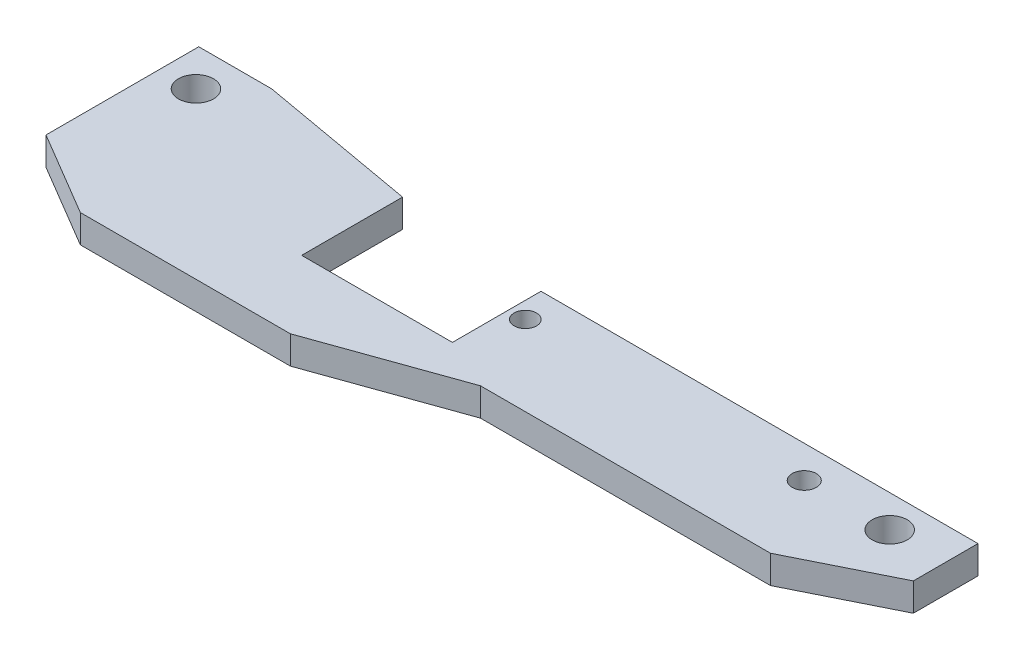
ISO-10303-21;
HEADER;
FILE_DESCRIPTION(('STEP AP214'),'2;1');
FILE_NAME('part.step','',(''),(''),'','','');
FILE_SCHEMA(('AUTOMOTIVE_DESIGN { 1 0 10303 214 1 1 1 1 }'));
ENDSEC;
DATA;
#1=APPLICATION_CONTEXT('core data for automotive mechanical design processes');
#2=APPLICATION_PROTOCOL_DEFINITION('international standard','automotive_design',2000,#1);
#3=PRODUCT_CONTEXT('',#1,'mechanical');
#4=PRODUCT('Part','Part','',(#3));
#5=PRODUCT_RELATED_PRODUCT_CATEGORY('part','',(#4));
#6=PRODUCT_DEFINITION_FORMATION('','',#4);
#7=PRODUCT_DEFINITION_CONTEXT('part definition',#1,'design');
#8=PRODUCT_DEFINITION('design','',#6,#7);
#9=PRODUCT_DEFINITION_SHAPE('','',#8);
#10=(LENGTH_UNIT() NAMED_UNIT(*) SI_UNIT(.MILLI.,.METRE.));
#11=(NAMED_UNIT(*) PLANE_ANGLE_UNIT() SI_UNIT($,.RADIAN.));
#12=(NAMED_UNIT(*) SI_UNIT($,.STERADIAN.) SOLID_ANGLE_UNIT());
#13=UNCERTAINTY_MEASURE_WITH_UNIT(LENGTH_MEASURE(1.E-05),#10,'distance_accuracy_value','');
#14=(GEOMETRIC_REPRESENTATION_CONTEXT(3) GLOBAL_UNCERTAINTY_ASSIGNED_CONTEXT((#13)) GLOBAL_UNIT_ASSIGNED_CONTEXT((#10,
#11,#12)) REPRESENTATION_CONTEXT('',''));
#15=CARTESIAN_POINT('',(0.,0.,0.));
#16=DIRECTION('',(0.,0.,1.));
#17=DIRECTION('',(1.,0.,0.));
#18=AXIS2_PLACEMENT_3D('',#15,#16,#17);
#19=CARTESIAN_POINT('',(0.,2.54,0.));
#20=DIRECTION('',(0.,-1.,0.));
#21=DIRECTION('',(0.,0.,-1.));
#22=AXIS2_PLACEMENT_3D('',#19,#20,#21);
#23=PLANE('',#22);
#24=DIRECTION('',(-1.,0.,0.));
#25=VECTOR('',#24,1.);
#26=CARTESIAN_POINT('',(24.145875,2.54,0.253999999999983));
#27=LINE('',#26,#25);
#28=CARTESIAN_POINT('',(71.12,2.54,0.253999999999983));
#29=VERTEX_POINT('',#28);
#30=CARTESIAN_POINT('',(31.52,2.54,0.253999999999983));
#31=VERTEX_POINT('',#30);
#32=EDGE_CURVE('E168',#29,#31,#27,.T.);
#33=ORIENTED_EDGE('',*,*,#32,.T.);
#34=DIRECTION('',(0.,0.,1.));
#35=VECTOR('',#34,1.);
#36=CARTESIAN_POINT('',(31.52,2.54,8.28024587558157));
#37=LINE('',#36,#35);
#38=CARTESIAN_POINT('',(31.52,2.54,8.28024587558157));
#39=VERTEX_POINT('',#38);
#40=EDGE_CURVE('E265',#31,#39,#37,.T.);
#41=ORIENTED_EDGE('',*,*,#40,.T.);
#42=DIRECTION('',(-1.,0.,0.));
#43=VECTOR('',#42,1.);
#44=CARTESIAN_POINT('',(31.52,2.54,8.28024587558157));
#45=LINE('',#44,#43);
#46=CARTESIAN_POINT('',(17.8578973191788,2.54,8.28024587558157));
#47=VERTEX_POINT('',#46);
#48=EDGE_CURVE('E273',#39,#47,#45,.T.);
#49=ORIENTED_EDGE('',*,*,#48,.T.);
#50=DIRECTION('',(0.,0.,-1.));
#51=VECTOR('',#50,1.);
#52=CARTESIAN_POINT('',(17.8578973191788,2.54,8.28024587558157));
#53=LINE('',#52,#51);
#54=CARTESIAN_POINT('',(17.8578973191788,2.54,-0.863862698812682));
#55=VERTEX_POINT('',#54);
#56=EDGE_CURVE('E262',#47,#55,#53,.T.);
#57=ORIENTED_EDGE('',*,*,#56,.T.);
#58=DIRECTION('',(-0.984562507785907,0.,-0.175033334717494));
#59=VECTOR('',#58,1.);
#60=CARTESIAN_POINT('',(3.42900000000006,2.54,-3.429));
#61=LINE('',#60,#59);
#62=CARTESIAN_POINT('',(3.42900000000006,2.54,-3.429));
#63=VERTEX_POINT('',#62);
#64=EDGE_CURVE('E101',#55,#63,#61,.T.);
#65=ORIENTED_EDGE('',*,*,#64,.T.);
#66=DIRECTION('',(-1.,0.,0.));
#67=VECTOR('',#66,1.);
#68=CARTESIAN_POINT('',(-3.17499999999998,2.54,-3.429));
#69=LINE('',#68,#67);
#70=CARTESIAN_POINT('',(-3.17499999999998,2.54,-3.429));
#71=VERTEX_POINT('',#70);
#72=EDGE_CURVE('E210',#63,#71,#69,.T.);
#73=ORIENTED_EDGE('',*,*,#72,.T.);
#74=DIRECTION('',(0.,0.,1.));
#75=VECTOR('',#74,1.);
#76=CARTESIAN_POINT('',(-3.17499999999998,2.54,-3.429));
#77=LINE('',#76,#75);
#78=CARTESIAN_POINT('',(-3.17499999999998,2.54,10.414));
#79=VERTEX_POINT('',#78);
#80=EDGE_CURVE('E207',#71,#79,#77,.T.);
#81=ORIENTED_EDGE('',*,*,#80,.T.);
#82=DIRECTION('',(0.860113535076458,0.,0.510102643375114));
#83=VECTOR('',#82,1.);
#84=CARTESIAN_POINT('',(4.46721168152167,2.54,14.946323025971));
#85=LINE('',#84,#83);
#86=CARTESIAN_POINT('',(4.46721168152167,2.54,14.946323025971));
#87=VERTEX_POINT('',#86);
#88=EDGE_CURVE('E209',#79,#87,#85,.T.);
#89=ORIENTED_EDGE('',*,*,#88,.T.);
#90=DIRECTION('',(1.,0.,0.));
#91=VECTOR('',#90,1.);
#92=CARTESIAN_POINT('',(23.4975463155963,2.54,14.946323025971));
#93=LINE('',#92,#91);
#94=CARTESIAN_POINT('',(23.4975463155963,2.54,14.946323025971));
#95=VERTEX_POINT('',#94);
#96=EDGE_CURVE('E212',#87,#95,#93,.T.);
#97=ORIENTED_EDGE('',*,*,#96,.T.);
#98=DIRECTION('',(0.941800205077323,0.,-0.336173130568629));
#99=VECTOR('',#98,1.);
#100=CARTESIAN_POINT('',(36.1950000000002,2.54,10.414));
#101=LINE('',#100,#99);
#102=CARTESIAN_POINT('',(36.1950000000002,2.54,10.414));
#103=VERTEX_POINT('',#102);
#104=EDGE_CURVE('E127',#95,#103,#101,.T.);
#105=ORIENTED_EDGE('',*,*,#104,.T.);
#106=DIRECTION('',(1.,0.,0.));
#107=VECTOR('',#106,1.);
#108=CARTESIAN_POINT('',(62.4739530384143,2.54,10.414));
#109=LINE('',#108,#107);
#110=CARTESIAN_POINT('',(62.4739530384143,2.54,10.414));
#111=VERTEX_POINT('',#110);
#112=EDGE_CURVE('E120',#103,#111,#109,.T.);
#113=ORIENTED_EDGE('',*,*,#112,.T.);
#114=DIRECTION('',(0.89533171087953,0.,-0.445399963508679));
#115=VECTOR('',#114,1.);
#116=CARTESIAN_POINT('',(71.12,2.54,6.11285780388403));
#117=LINE('',#116,#115);
#118=CARTESIAN_POINT('',(71.12,2.54,6.11285780388403));
#119=VERTEX_POINT('',#118);
#120=EDGE_CURVE('E124',#111,#119,#117,.T.);
#121=ORIENTED_EDGE('',*,*,#120,.T.);
#122=DIRECTION('',(0.,0.,-1.));
#123=VECTOR('',#122,1.);
#124=CARTESIAN_POINT('',(71.12,2.54,0.253999999999983));
#125=LINE('',#124,#123);
#126=EDGE_CURVE('E57',#119,#29,#125,.T.);
#127=ORIENTED_EDGE('',*,*,#126,.T.);
#128=EDGE_LOOP('',(#33,#41,#49,#57,#65,#73,#81,#89,#97,#105,#113,#121,#127));
#129=FACE_BOUND('',#128,.T.);
#130=CARTESIAN_POINT('',(66.04,2.54,3.175));
#131=DIRECTION('',(0.,1.,0.));
#132=DIRECTION('',(0.,0.,1.));
#133=AXIS2_PLACEMENT_3D('',#130,#131,#132);
#134=CIRCLE('',#133,1.5875);
#135=CARTESIAN_POINT('',(66.04,2.54,4.7625));
#136=VERTEX_POINT('',#135);
#137=EDGE_CURVE('E244',#136,#136,#134,.T.);
#138=ORIENTED_EDGE('',*,*,#137,.F.);
#139=EDGE_LOOP('',(#138));
#140=FACE_BOUND('',#139,.T.);
#141=CARTESIAN_POINT('',(0.,2.54,0.));
#142=DIRECTION('',(0.,1.,0.));
#143=DIRECTION('',(0.,0.,1.));
#144=AXIS2_PLACEMENT_3D('',#141,#142,#143);
#145=CIRCLE('',#144,1.5875);
#146=CARTESIAN_POINT('',(0.,2.54,1.5875));
#147=VERTEX_POINT('',#146);
#148=EDGE_CURVE('E152',#147,#147,#145,.T.);
#149=ORIENTED_EDGE('',*,*,#148,.F.);
#150=EDGE_LOOP('',(#149));
#151=FACE_BOUND('',#150,.T.);
#152=CARTESIAN_POINT('',(33.02,2.54,3.175));
#153=DIRECTION('',(0.,1.,0.));
#154=DIRECTION('',(0.,0.,1.));
#155=AXIS2_PLACEMENT_3D('',#152,#153,#154);
#156=CIRCLE('',#155,1.016);
#157=CARTESIAN_POINT('',(33.02,2.54,4.191));
#158=VERTEX_POINT('',#157);
#159=EDGE_CURVE('E238',#158,#158,#156,.T.);
#160=ORIENTED_EDGE('',*,*,#159,.F.);
#161=EDGE_LOOP('',(#160));
#162=FACE_BOUND('',#161,.T.);
#163=CARTESIAN_POINT('',(58.296606113269,2.54,3.175));
#164=DIRECTION('',(0.,1.,0.));
#165=DIRECTION('',(0.,0.,1.));
#166=AXIS2_PLACEMENT_3D('',#163,#164,#165);
#167=CIRCLE('',#166,1.0922);
#168=CARTESIAN_POINT('',(58.296606113269,2.54,4.2672));
#169=VERTEX_POINT('',#168);
#170=EDGE_CURVE('E250',#169,#169,#167,.T.);
#171=ORIENTED_EDGE('',*,*,#170,.F.);
#172=EDGE_LOOP('',(#171));
#173=FACE_BOUND('',#172,.T.);
#174=ADVANCED_FACE('F33',(#129,#140,#151,#162,#173),#23,.F.);
#175=CARTESIAN_POINT('',(0.,0.,0.));
#176=DIRECTION('',(0.,-1.,0.));
#177=DIRECTION('',(0.,0.,-1.));
#178=AXIS2_PLACEMENT_3D('',#175,#176,#177);
#179=PLANE('',#178);
#180=DIRECTION('',(0.,0.,1.));
#181=VECTOR('',#180,1.);
#182=CARTESIAN_POINT('',(31.52,0.,8.28024587558157));
#183=LINE('',#182,#181);
#184=CARTESIAN_POINT('',(31.52,0.,0.253999999999983));
#185=VERTEX_POINT('',#184);
#186=CARTESIAN_POINT('',(31.52,0.,8.28024587558157));
#187=VERTEX_POINT('',#186);
#188=EDGE_CURVE('E269',#185,#187,#183,.T.);
#189=ORIENTED_EDGE('',*,*,#188,.F.);
#190=DIRECTION('',(-1.,0.,0.));
#191=VECTOR('',#190,1.);
#192=CARTESIAN_POINT('',(24.145875,0.,0.253999999999983));
#193=LINE('',#192,#191);
#194=CARTESIAN_POINT('',(71.12,0.,0.253999999999983));
#195=VERTEX_POINT('',#194);
#196=EDGE_CURVE('E148',#195,#185,#193,.T.);
#197=ORIENTED_EDGE('',*,*,#196,.F.);
#198=DIRECTION('',(0.,0.,-1.));
#199=VECTOR('',#198,1.);
#200=CARTESIAN_POINT('',(71.12,0.,0.253999999999983));
#201=LINE('',#200,#199);
#202=CARTESIAN_POINT('',(71.12,0.,6.11285780388403));
#203=VERTEX_POINT('',#202);
#204=EDGE_CURVE('E93',#203,#195,#201,.T.);
#205=ORIENTED_EDGE('',*,*,#204,.F.);
#206=DIRECTION('',(0.89533171087953,0.,-0.445399963508679));
#207=VECTOR('',#206,1.);
#208=CARTESIAN_POINT('',(71.12,0.,6.11285780388403));
#209=LINE('',#208,#207);
#210=CARTESIAN_POINT('',(62.4739530384143,0.,10.414));
#211=VERTEX_POINT('',#210);
#212=EDGE_CURVE('E165',#211,#203,#209,.T.);
#213=ORIENTED_EDGE('',*,*,#212,.F.);
#214=DIRECTION('',(1.,0.,0.));
#215=VECTOR('',#214,1.);
#216=CARTESIAN_POINT('',(62.4739530384143,0.,10.414));
#217=LINE('',#216,#215);
#218=CARTESIAN_POINT('',(36.1950000000002,0.,10.414));
#219=VERTEX_POINT('',#218);
#220=EDGE_CURVE('E136',#219,#211,#217,.T.);
#221=ORIENTED_EDGE('',*,*,#220,.F.);
#222=DIRECTION('',(0.941800205077323,0.,-0.336173130568629));
#223=VECTOR('',#222,1.);
#224=CARTESIAN_POINT('',(36.1950000000002,0.,10.414));
#225=LINE('',#224,#223);
#226=CARTESIAN_POINT('',(23.4975463155963,0.,14.946323025971));
#227=VERTEX_POINT('',#226);
#228=EDGE_CURVE('E162',#227,#219,#225,.T.);
#229=ORIENTED_EDGE('',*,*,#228,.F.);
#230=DIRECTION('',(1.,0.,0.));
#231=VECTOR('',#230,1.);
#232=CARTESIAN_POINT('',(23.4975463155963,0.,14.946323025971));
#233=LINE('',#232,#231);
#234=CARTESIAN_POINT('',(4.46721168152167,0.,14.946323025971));
#235=VERTEX_POINT('',#234);
#236=EDGE_CURVE('E160',#235,#227,#233,.T.);
#237=ORIENTED_EDGE('',*,*,#236,.F.);
#238=DIRECTION('',(0.860113535076458,0.,0.510102643375114));
#239=VECTOR('',#238,1.);
#240=CARTESIAN_POINT('',(4.46721168152167,0.,14.946323025971));
#241=LINE('',#240,#239);
#242=CARTESIAN_POINT('',(-3.17499999999998,0.,10.414));
#243=VERTEX_POINT('',#242);
#244=EDGE_CURVE('E158',#243,#235,#241,.T.);
#245=ORIENTED_EDGE('',*,*,#244,.F.);
#246=DIRECTION('',(0.,0.,1.));
#247=VECTOR('',#246,1.);
#248=CARTESIAN_POINT('',(-3.17499999999998,0.,-3.429));
#249=LINE('',#248,#247);
#250=CARTESIAN_POINT('',(-3.17499999999998,0.,-3.429));
#251=VERTEX_POINT('',#250);
#252=EDGE_CURVE('E156',#251,#243,#249,.T.);
#253=ORIENTED_EDGE('',*,*,#252,.F.);
#254=DIRECTION('',(-1.,0.,0.));
#255=VECTOR('',#254,1.);
#256=CARTESIAN_POINT('',(-3.17499999999998,0.,-3.429));
#257=LINE('',#256,#255);
#258=CARTESIAN_POINT('',(3.42900000000006,0.,-3.429));
#259=VERTEX_POINT('',#258);
#260=EDGE_CURVE('E154',#259,#251,#257,.T.);
#261=ORIENTED_EDGE('',*,*,#260,.F.);
#262=DIRECTION('',(-0.984562507785907,0.,-0.175033334717494));
#263=VECTOR('',#262,1.);
#264=CARTESIAN_POINT('',(3.42900000000006,0.,-3.429));
#265=LINE('',#264,#263);
#266=CARTESIAN_POINT('',(17.8578973191788,0.,-0.863862698812683));
#267=VERTEX_POINT('',#266);
#268=EDGE_CURVE('E151',#267,#259,#265,.T.);
#269=ORIENTED_EDGE('',*,*,#268,.F.);
#270=DIRECTION('',(0.,0.,-1.));
#271=VECTOR('',#270,1.);
#272=CARTESIAN_POINT('',(17.8578973191788,0.,8.28024587558157));
#273=LINE('',#272,#271);
#274=CARTESIAN_POINT('',(17.8578973191788,0.,8.28024587558157));
#275=VERTEX_POINT('',#274);
#276=EDGE_CURVE('E48',#275,#267,#273,.T.);
#277=ORIENTED_EDGE('',*,*,#276,.F.);
#278=DIRECTION('',(-1.,0.,0.));
#279=VECTOR('',#278,1.);
#280=CARTESIAN_POINT('',(31.52,0.,8.28024587558157));
#281=LINE('',#280,#279);
#282=EDGE_CURVE('E266',#187,#275,#281,.T.);
#283=ORIENTED_EDGE('',*,*,#282,.F.);
#284=EDGE_LOOP('',(#189,#197,#205,#213,#221,#229,#237,#245,#253,#261,#269,#277,#283));
#285=FACE_BOUND('',#284,.T.);
#286=CARTESIAN_POINT('',(66.04,0.,3.175));
#287=DIRECTION('',(0.,1.,0.));
#288=DIRECTION('',(0.,0.,1.));
#289=AXIS2_PLACEMENT_3D('',#286,#287,#288);
#290=CIRCLE('',#289,1.5875);
#291=CARTESIAN_POINT('',(66.04,0.,4.7625));
#292=VERTEX_POINT('',#291);
#293=EDGE_CURVE('E247',#292,#292,#290,.T.);
#294=ORIENTED_EDGE('',*,*,#293,.T.);
#295=EDGE_LOOP('',(#294));
#296=FACE_BOUND('',#295,.T.);
#297=CARTESIAN_POINT('',(0.,0.,0.));
#298=DIRECTION('',(0.,1.,0.));
#299=DIRECTION('',(0.,0.,1.));
#300=AXIS2_PLACEMENT_3D('',#297,#298,#299);
#301=CIRCLE('',#300,1.5875);
#302=CARTESIAN_POINT('',(0.,0.,1.5875));
#303=VERTEX_POINT('',#302);
#304=EDGE_CURVE('E235',#303,#303,#301,.T.);
#305=ORIENTED_EDGE('',*,*,#304,.T.);
#306=EDGE_LOOP('',(#305));
#307=FACE_BOUND('',#306,.T.);
#308=CARTESIAN_POINT('',(33.02,0.,3.175));
#309=DIRECTION('',(0.,1.,0.));
#310=DIRECTION('',(0.,0.,1.));
#311=AXIS2_PLACEMENT_3D('',#308,#309,#310);
#312=CIRCLE('',#311,1.016);
#313=CARTESIAN_POINT('',(33.02,0.,4.191));
#314=VERTEX_POINT('',#313);
#315=EDGE_CURVE('E241',#314,#314,#312,.T.);
#316=ORIENTED_EDGE('',*,*,#315,.T.);
#317=EDGE_LOOP('',(#316));
#318=FACE_BOUND('',#317,.T.);
#319=CARTESIAN_POINT('',(58.296606113269,0.,3.175));
#320=DIRECTION('',(0.,1.,0.));
#321=DIRECTION('',(0.,0.,1.));
#322=AXIS2_PLACEMENT_3D('',#319,#320,#321);
#323=CIRCLE('',#322,1.0922);
#324=CARTESIAN_POINT('',(58.296606113269,0.,4.2672));
#325=VERTEX_POINT('',#324);
#326=EDGE_CURVE('E253',#325,#325,#323,.T.);
#327=ORIENTED_EDGE('',*,*,#326,.T.);
#328=EDGE_LOOP('',(#327));
#329=FACE_BOUND('',#328,.T.);
#330=ADVANCED_FACE('F193',(#285,#296,#307,#318,#329),#179,.T.);
#331=CARTESIAN_POINT('',(24.145875,2.54,0.253999999999983));
#332=DIRECTION('',(0.,0.,1.));
#333=DIRECTION('',(1.,0.,0.));
#334=AXIS2_PLACEMENT_3D('',#331,#332,#333);
#335=PLANE('',#334);
#336=ORIENTED_EDGE('',*,*,#196,.T.);
#337=DIRECTION('',(0.,1.,0.));
#338=VECTOR('',#337,1.);
#339=CARTESIAN_POINT('',(31.52,2.54,0.253999999999983));
#340=LINE('',#339,#338);
#341=EDGE_CURVE('E11',#185,#31,#340,.T.);
#342=ORIENTED_EDGE('',*,*,#341,.T.);
#343=ORIENTED_EDGE('',*,*,#32,.F.);
#344=DIRECTION('',(0.,-1.,0.));
#345=VECTOR('',#344,1.);
#346=CARTESIAN_POINT('',(71.12,2.54,0.253999999999983));
#347=LINE('',#346,#345);
#348=EDGE_CURVE('E144',#29,#195,#347,.T.);
#349=ORIENTED_EDGE('',*,*,#348,.T.);
#350=EDGE_LOOP('',(#336,#342,#343,#349));
#351=FACE_BOUND('',#350,.T.);
#352=ADVANCED_FACE('F35',(#351),#335,.F.);
#353=CARTESIAN_POINT('',(3.42900000000006,2.54,-3.429));
#354=DIRECTION('',(-0.175033334717494,0.,0.984562507785907));
#355=DIRECTION('',(0.984562507785907,0.,0.175033334717494));
#356=AXIS2_PLACEMENT_3D('',#353,#354,#355);
#357=PLANE('',#356);
#358=ORIENTED_EDGE('',*,*,#64,.F.);
#359=DIRECTION('',(0.,-1.,0.));
#360=VECTOR('',#359,1.);
#361=CARTESIAN_POINT('',(17.8578973191788,2.54,-0.863862698812682));
#362=LINE('',#361,#360);
#363=EDGE_CURVE('E41',#55,#267,#362,.T.);
#364=ORIENTED_EDGE('',*,*,#363,.T.);
#365=ORIENTED_EDGE('',*,*,#268,.T.);
#366=DIRECTION('',(0.,-1.,0.));
#367=VECTOR('',#366,1.);
#368=CARTESIAN_POINT('',(3.42900000000006,2.54,-3.429));
#369=LINE('',#368,#367);
#370=EDGE_CURVE('E184',#63,#259,#369,.T.);
#371=ORIENTED_EDGE('',*,*,#370,.F.);
#372=EDGE_LOOP('',(#358,#364,#365,#371));
#373=FACE_BOUND('',#372,.T.);
#374=ADVANCED_FACE('F188',(#373),#357,.F.);
#375=CARTESIAN_POINT('',(-3.17499999999998,2.54,-3.429));
#376=DIRECTION('',(0.,0.,1.));
#377=DIRECTION('',(1.,0.,0.));
#378=AXIS2_PLACEMENT_3D('',#375,#376,#377);
#379=PLANE('',#378);
#380=ORIENTED_EDGE('',*,*,#260,.T.);
#381=DIRECTION('',(0.,-1.,0.));
#382=VECTOR('',#381,1.);
#383=CARTESIAN_POINT('',(-3.17499999999998,2.54,-3.429));
#384=LINE('',#383,#382);
#385=EDGE_CURVE('E181',#71,#251,#384,.T.);
#386=ORIENTED_EDGE('',*,*,#385,.F.);
#387=ORIENTED_EDGE('',*,*,#72,.F.);
#388=ORIENTED_EDGE('',*,*,#370,.T.);
#389=EDGE_LOOP('',(#380,#386,#387,#388));
#390=FACE_BOUND('',#389,.T.);
#391=ADVANCED_FACE('F201',(#390),#379,.F.);
#392=CARTESIAN_POINT('',(-3.17499999999998,2.54,-3.429));
#393=DIRECTION('',(1.,0.,0.));
#394=DIRECTION('',(0.,0.,-1.));
#395=AXIS2_PLACEMENT_3D('',#392,#393,#394);
#396=PLANE('',#395);
#397=ORIENTED_EDGE('',*,*,#252,.T.);
#398=DIRECTION('',(0.,-1.,0.));
#399=VECTOR('',#398,1.);
#400=CARTESIAN_POINT('',(-3.17499999999998,2.54,10.414));
#401=LINE('',#400,#399);
#402=EDGE_CURVE('E178',#79,#243,#401,.T.);
#403=ORIENTED_EDGE('',*,*,#402,.F.);
#404=ORIENTED_EDGE('',*,*,#80,.F.);
#405=ORIENTED_EDGE('',*,*,#385,.T.);
#406=EDGE_LOOP('',(#397,#403,#404,#405));
#407=FACE_BOUND('',#406,.T.);
#408=ADVANCED_FACE('F205',(#407),#396,.F.);
#409=CARTESIAN_POINT('',(4.46721168152167,2.54,14.946323025971));
#410=DIRECTION('',(0.510102643375114,0.,-0.860113535076458));
#411=DIRECTION('',(-0.860113535076458,0.,-0.510102643375114));
#412=AXIS2_PLACEMENT_3D('',#409,#410,#411);
#413=PLANE('',#412);
#414=ORIENTED_EDGE('',*,*,#244,.T.);
#415=DIRECTION('',(0.,-1.,0.));
#416=VECTOR('',#415,1.);
#417=CARTESIAN_POINT('',(4.46721168152167,2.54,14.946323025971));
#418=LINE('',#417,#416);
#419=EDGE_CURVE('E175',#87,#235,#418,.T.);
#420=ORIENTED_EDGE('',*,*,#419,.F.);
#421=ORIENTED_EDGE('',*,*,#88,.F.);
#422=ORIENTED_EDGE('',*,*,#402,.T.);
#423=EDGE_LOOP('',(#414,#420,#421,#422));
#424=FACE_BOUND('',#423,.T.);
#425=ADVANCED_FACE('F323',(#424),#413,.F.);
#426=CARTESIAN_POINT('',(23.4975463155963,2.54,14.946323025971));
#427=DIRECTION('',(0.,0.,-1.));
#428=DIRECTION('',(-1.,0.,0.));
#429=AXIS2_PLACEMENT_3D('',#426,#427,#428);
#430=PLANE('',#429);
#431=ORIENTED_EDGE('',*,*,#236,.T.);
#432=DIRECTION('',(0.,-1.,0.));
#433=VECTOR('',#432,1.);
#434=CARTESIAN_POINT('',(23.4975463155963,2.54,14.946323025971));
#435=LINE('',#434,#433);
#436=EDGE_CURVE('E172',#95,#227,#435,.T.);
#437=ORIENTED_EDGE('',*,*,#436,.F.);
#438=ORIENTED_EDGE('',*,*,#96,.F.);
#439=ORIENTED_EDGE('',*,*,#419,.T.);
#440=EDGE_LOOP('',(#431,#437,#438,#439));
#441=FACE_BOUND('',#440,.T.);
#442=ADVANCED_FACE('F221',(#441),#430,.F.);
#443=CARTESIAN_POINT('',(36.1950000000002,2.54,10.414));
#444=DIRECTION('',(-0.336173130568629,0.,-0.941800205077323));
#445=DIRECTION('',(-0.941800205077323,0.,0.336173130568629));
#446=AXIS2_PLACEMENT_3D('',#443,#444,#445);
#447=PLANE('',#446);
#448=ORIENTED_EDGE('',*,*,#228,.T.);
#449=DIRECTION('',(0.,-1.,0.));
#450=VECTOR('',#449,1.);
#451=CARTESIAN_POINT('',(36.1950000000002,2.54,10.414));
#452=LINE('',#451,#450);
#453=EDGE_CURVE('E139',#103,#219,#452,.T.);
#454=ORIENTED_EDGE('',*,*,#453,.F.);
#455=ORIENTED_EDGE('',*,*,#104,.F.);
#456=ORIENTED_EDGE('',*,*,#436,.T.);
#457=EDGE_LOOP('',(#448,#454,#455,#456));
#458=FACE_BOUND('',#457,.T.);
#459=ADVANCED_FACE('F225',(#458),#447,.F.);
#460=CARTESIAN_POINT('',(62.4739530384143,2.54,10.414));
#461=DIRECTION('',(0.,0.,-1.));
#462=DIRECTION('',(-1.,0.,0.));
#463=AXIS2_PLACEMENT_3D('',#460,#461,#462);
#464=PLANE('',#463);
#465=ORIENTED_EDGE('',*,*,#220,.T.);
#466=DIRECTION('',(0.,-1.,0.));
#467=VECTOR('',#466,1.);
#468=CARTESIAN_POINT('',(62.4739530384143,2.54,10.414));
#469=LINE('',#468,#467);
#470=EDGE_CURVE('E133',#111,#211,#469,.T.);
#471=ORIENTED_EDGE('',*,*,#470,.F.);
#472=ORIENTED_EDGE('',*,*,#112,.F.);
#473=ORIENTED_EDGE('',*,*,#453,.T.);
#474=EDGE_LOOP('',(#465,#471,#472,#473));
#475=FACE_BOUND('',#474,.T.);
#476=ADVANCED_FACE('F134',(#475),#464,.F.);
#477=CARTESIAN_POINT('',(71.12,2.54,6.11285780388403));
#478=DIRECTION('',(-0.445399963508679,0.,-0.89533171087953));
#479=DIRECTION('',(-0.895331710879531,0.,0.445399963508679));
#480=AXIS2_PLACEMENT_3D('',#477,#478,#479);
#481=PLANE('',#480);
#482=ORIENTED_EDGE('',*,*,#212,.T.);
#483=DIRECTION('',(0.,-1.,0.));
#484=VECTOR('',#483,1.);
#485=CARTESIAN_POINT('',(71.12,2.54,6.11285780388403));
#486=LINE('',#485,#484);
#487=EDGE_CURVE('E140',#119,#203,#486,.T.);
#488=ORIENTED_EDGE('',*,*,#487,.F.);
#489=ORIENTED_EDGE('',*,*,#120,.F.);
#490=ORIENTED_EDGE('',*,*,#470,.T.);
#491=EDGE_LOOP('',(#482,#488,#489,#490));
#492=FACE_BOUND('',#491,.T.);
#493=ADVANCED_FACE('F142',(#492),#481,.F.);
#494=CARTESIAN_POINT('',(71.12,2.54,0.253999999999983));
#495=DIRECTION('',(-1.,0.,0.));
#496=DIRECTION('',(0.,0.,1.));
#497=AXIS2_PLACEMENT_3D('',#494,#495,#496);
#498=PLANE('',#497);
#499=ORIENTED_EDGE('',*,*,#204,.T.);
#500=ORIENTED_EDGE('',*,*,#348,.F.);
#501=ORIENTED_EDGE('',*,*,#126,.F.);
#502=ORIENTED_EDGE('',*,*,#487,.T.);
#503=EDGE_LOOP('',(#499,#500,#501,#502));
#504=FACE_BOUND('',#503,.T.);
#505=ADVANCED_FACE('F227',(#504),#498,.F.);
#506=CARTESIAN_POINT('',(0.,2.54,0.));
#507=DIRECTION('',(0.,-1.,0.));
#508=DIRECTION('',(0.,0.,-1.));
#509=AXIS2_PLACEMENT_3D('',#506,#507,#508);
#510=CYLINDRICAL_SURFACE('',#509,1.5875);
#511=ORIENTED_EDGE('',*,*,#148,.T.);
#512=EDGE_LOOP('',(#511));
#513=FACE_BOUND('',#512,.T.);
#514=ORIENTED_EDGE('',*,*,#304,.F.);
#515=EDGE_LOOP('',(#514));
#516=FACE_BOUND('',#515,.T.);
#517=ADVANCED_FACE('F310',(#513,#516),#510,.F.);
#518=CARTESIAN_POINT('',(33.02,2.54,3.175));
#519=DIRECTION('',(0.,-1.,0.));
#520=DIRECTION('',(0.,0.,-1.));
#521=AXIS2_PLACEMENT_3D('',#518,#519,#520);
#522=CYLINDRICAL_SURFACE('',#521,1.016);
#523=ORIENTED_EDGE('',*,*,#159,.T.);
#524=EDGE_LOOP('',(#523));
#525=FACE_BOUND('',#524,.T.);
#526=ORIENTED_EDGE('',*,*,#315,.F.);
#527=EDGE_LOOP('',(#526));
#528=FACE_BOUND('',#527,.T.);
#529=ADVANCED_FACE('F364',(#525,#528),#522,.F.);
#530=CARTESIAN_POINT('',(66.04,2.54,3.175));
#531=DIRECTION('',(0.,-1.,0.));
#532=DIRECTION('',(0.,0.,-1.));
#533=AXIS2_PLACEMENT_3D('',#530,#531,#532);
#534=CYLINDRICAL_SURFACE('',#533,1.5875);
#535=ORIENTED_EDGE('',*,*,#137,.T.);
#536=EDGE_LOOP('',(#535));
#537=FACE_BOUND('',#536,.T.);
#538=ORIENTED_EDGE('',*,*,#293,.F.);
#539=EDGE_LOOP('',(#538));
#540=FACE_BOUND('',#539,.T.);
#541=ADVANCED_FACE('F353',(#537,#540),#534,.F.);
#542=CARTESIAN_POINT('',(58.296606113269,2.54,3.175));
#543=DIRECTION('',(0.,-1.,0.));
#544=DIRECTION('',(0.,0.,-1.));
#545=AXIS2_PLACEMENT_3D('',#542,#543,#544);
#546=CYLINDRICAL_SURFACE('',#545,1.0922);
#547=ORIENTED_EDGE('',*,*,#170,.T.);
#548=EDGE_LOOP('',(#547));
#549=FACE_BOUND('',#548,.T.);
#550=ORIENTED_EDGE('',*,*,#326,.F.);
#551=EDGE_LOOP('',(#550));
#552=FACE_BOUND('',#551,.T.);
#553=ADVANCED_FACE('F301',(#549,#552),#546,.F.);
#554=CARTESIAN_POINT('',(31.52,2.54,8.28024587558157));
#555=DIRECTION('',(1.,0.,0.));
#556=DIRECTION('',(0.,0.,-1.));
#557=AXIS2_PLACEMENT_3D('',#554,#555,#556);
#558=PLANE('',#557);
#559=ORIENTED_EDGE('',*,*,#188,.T.);
#560=DIRECTION('',(0.,-1.,0.));
#561=VECTOR('',#560,1.);
#562=CARTESIAN_POINT('',(31.52,2.54,8.28024587558157));
#563=LINE('',#562,#561);
#564=EDGE_CURVE('E259',#39,#187,#563,.T.);
#565=ORIENTED_EDGE('',*,*,#564,.F.);
#566=ORIENTED_EDGE('',*,*,#40,.F.);
#567=ORIENTED_EDGE('',*,*,#341,.F.);
#568=EDGE_LOOP('',(#559,#565,#566,#567));
#569=FACE_BOUND('',#568,.T.);
#570=ADVANCED_FACE('F283',(#569),#558,.F.);
#571=CARTESIAN_POINT('',(17.8578973191788,2.54,8.28024587558157));
#572=DIRECTION('',(-1.,0.,0.));
#573=DIRECTION('',(0.,0.,1.));
#574=AXIS2_PLACEMENT_3D('',#571,#572,#573);
#575=PLANE('',#574);
#576=ORIENTED_EDGE('',*,*,#56,.F.);
#577=DIRECTION('',(0.,-1.,0.));
#578=VECTOR('',#577,1.);
#579=CARTESIAN_POINT('',(17.8578973191788,2.54,8.28024587558157));
#580=LINE('',#579,#578);
#581=EDGE_CURVE('E256',#47,#275,#580,.T.);
#582=ORIENTED_EDGE('',*,*,#581,.T.);
#583=ORIENTED_EDGE('',*,*,#276,.T.);
#584=ORIENTED_EDGE('',*,*,#363,.F.);
#585=EDGE_LOOP('',(#576,#582,#583,#584));
#586=FACE_BOUND('',#585,.T.);
#587=ADVANCED_FACE('F293',(#586),#575,.F.);
#588=CARTESIAN_POINT('',(31.52,2.54,8.28024587558157));
#589=DIRECTION('',(0.,0.,1.));
#590=DIRECTION('',(1.,0.,0.));
#591=AXIS2_PLACEMENT_3D('',#588,#589,#590);
#592=PLANE('',#591);
#593=ORIENTED_EDGE('',*,*,#282,.T.);
#594=ORIENTED_EDGE('',*,*,#581,.F.);
#595=ORIENTED_EDGE('',*,*,#48,.F.);
#596=ORIENTED_EDGE('',*,*,#564,.T.);
#597=EDGE_LOOP('',(#593,#594,#595,#596));
#598=FACE_BOUND('',#597,.T.);
#599=ADVANCED_FACE('F292',(#598),#592,.F.);
#600=CLOSED_SHELL('',(#174,#330,#352,#374,#391,#408,#425,#442,#459,#476,#493,#505,#517,#529,
#541,#553,#570,#587,#599));
#601=MANIFOLD_SOLID_BREP('B2',#600);
#602=ADVANCED_BREP_SHAPE_REPRESENTATION('',(#18,#601),#14);
#603=SHAPE_DEFINITION_REPRESENTATION(#9,#602);
ENDSEC;
END-ISO-10303-21;
